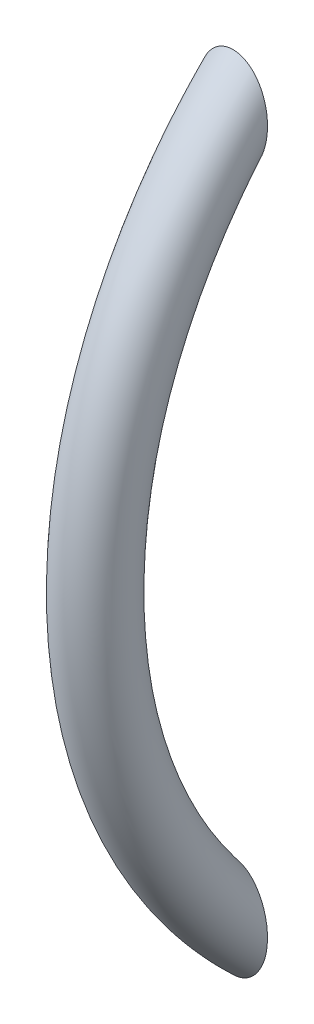
ISO-10303-21;
HEADER;
FILE_DESCRIPTION(('STEP AP214'),'2;1');
FILE_NAME('part.step','',(''),(''),'','','');
FILE_SCHEMA(('AUTOMOTIVE_DESIGN { 1 0 10303 214 1 1 1 1 }'));
ENDSEC;
DATA;
#1=APPLICATION_CONTEXT('core data for automotive mechanical design processes');
#2=APPLICATION_PROTOCOL_DEFINITION('international standard','automotive_design',2000,#1);
#3=PRODUCT_CONTEXT('',#1,'mechanical');
#4=PRODUCT('Part','Part','',(#3));
#5=PRODUCT_RELATED_PRODUCT_CATEGORY('part','',(#4));
#6=PRODUCT_DEFINITION_FORMATION('','',#4);
#7=PRODUCT_DEFINITION_CONTEXT('part definition',#1,'design');
#8=PRODUCT_DEFINITION('design','',#6,#7);
#9=PRODUCT_DEFINITION_SHAPE('','',#8);
#10=(LENGTH_UNIT() NAMED_UNIT(*) SI_UNIT(.MILLI.,.METRE.));
#11=(NAMED_UNIT(*) PLANE_ANGLE_UNIT() SI_UNIT($,.RADIAN.));
#12=(NAMED_UNIT(*) SI_UNIT($,.STERADIAN.) SOLID_ANGLE_UNIT());
#13=UNCERTAINTY_MEASURE_WITH_UNIT(LENGTH_MEASURE(1.E-05),#10,'distance_accuracy_value','');
#14=(GEOMETRIC_REPRESENTATION_CONTEXT(3) GLOBAL_UNCERTAINTY_ASSIGNED_CONTEXT((#13)) GLOBAL_UNIT_ASSIGNED_CONTEXT((#10,
#11,#12)) REPRESENTATION_CONTEXT('',''));
#15=CARTESIAN_POINT('',(0.,0.,0.));
#16=DIRECTION('',(0.,0.,1.));
#17=DIRECTION('',(1.,0.,0.));
#18=AXIS2_PLACEMENT_3D('',#15,#16,#17);
#19=CARTESIAN_POINT('',(-5.,-135.,0.));
#20=DIRECTION('',(0.,0.,1.));
#21=DIRECTION('',(1.,0.,0.));
#22=AXIS2_PLACEMENT_3D('',#19,#20,#21);
#23=PLANE('',#22);
#24=CARTESIAN_POINT('',(-2.34143220268921,-105.290489880751,0.));
#25=CARTESIAN_POINT('',(-2.16223381464412,-105.422127991153,0.));
#26=CARTESIAN_POINT('',(-1.97343885671479,-105.541187005868,0.));
#27=CARTESIAN_POINT('',(-1.67807058937642,-105.6963945522,0.));
#28=CARTESIAN_POINT('',(-1.57750229942348,-105.744261655668,0.));
#29=CARTESIAN_POINT('',(-1.37277015435048,-105.831524798696,0.));
#30=CARTESIAN_POINT('',(-1.26860798277112,-105.870924743782,0.));
#31=CARTESIAN_POINT('',(-1.05662525994243,-105.940843913188,0.));
#32=CARTESIAN_POINT('',(-0.948786052995977,-105.971306650597,0.));
#33=CARTESIAN_POINT('',(-0.730854813389401,-106.022478319425,0.));
#34=CARTESIAN_POINT('',(-0.620763732220418,-106.043191285103,0.));
#35=CARTESIAN_POINT('',(-0.399181796547366,-106.074484298361,0.));
#36=CARTESIAN_POINT('',(-0.28769139340899,-106.085067532403,0.));
#37=CARTESIAN_POINT('',(-0.0642122153162576,-106.095903569474,0.));
#38=CARTESIAN_POINT('',(0.0477765284588175,-106.096157009956,0.));
#39=CARTESIAN_POINT('',(0.263571391346182,-106.086671302039,0.));
#40=CARTESIAN_POINT('',(0.367408506280311,-106.077621019646,0.));
#41=CARTESIAN_POINT('',(0.573968617039572,-106.050719038081,0.));
#42=CARTESIAN_POINT('',(0.676691230488974,-106.032864410085,0.));
#43=CARTESIAN_POINT('',(0.880257799715599,-105.988648619741,0.));
#44=CARTESIAN_POINT('',(0.981102269587336,-105.962289822497,0.));
#45=CARTESIAN_POINT('',(1.18033594101478,-105.901478425116,0.));
#46=CARTESIAN_POINT('',(1.27872416007487,-105.867022641816,0.));
#47=CARTESIAN_POINT('',(1.57133839823747,-105.751441224562,0.));
#48=CARTESIAN_POINT('',(1.76102395195068,-105.6585448116,0.));
#49=CARTESIAN_POINT('',(2.1248464842067,-105.446346791508,0.));
#50=CARTESIAN_POINT('',(2.29897600292656,-105.327032610249,0.));
#51=CARTESIAN_POINT('',(2.58490090659034,-105.102323238759,0.));
#52=CARTESIAN_POINT('',(2.70074630219669,-105.002004100328,0.));
#53=CARTESIAN_POINT('',(2.92319529838527,-104.791577114148,0.));
#54=CARTESIAN_POINT('',(3.02979552739169,-104.681465724712,0.));
#55=CARTESIAN_POINT('',(3.33594670459079,-104.338359343486,0.));
#56=CARTESIAN_POINT('',(3.52160594326417,-104.092788289708,0.));
#57=CARTESIAN_POINT('',(3.80443203566377,-103.65887658351,0.));
#58=CARTESIAN_POINT('',(3.9111507900484,-103.476531839304,0.));
#59=CARTESIAN_POINT('',(4.10829790211831,-103.103224826291,0.));
#60=CARTESIAN_POINT('',(4.19872719078455,-102.912263050749,0.));
#61=CARTESIAN_POINT('',(4.36411184266114,-102.523536078742,0.));
#62=CARTESIAN_POINT('',(4.43904829393084,-102.325762907063,0.));
#63=CARTESIAN_POINT('',(4.57406374736376,-101.92524294268,0.));
#64=CARTESIAN_POINT('',(4.634142663205,-101.722496121089,0.));
#65=CARTESIAN_POINT('',(4.75820195554744,-101.243554230596,0.));
#66=CARTESIAN_POINT('',(4.81652798885232,-100.965886647963,0.));
#67=CARTESIAN_POINT('',(4.90908802326897,-100.406542924906,0.));
#68=CARTESIAN_POINT('',(4.94331393904633,-100.124865471515,0.));
#69=CARTESIAN_POINT('',(4.98876410461981,-99.5593468503363,0.));
#70=CARTESIAN_POINT('',(4.99996108927094,-99.2755035166713,0.));
#71=CARTESIAN_POINT('',(5.00003870562935,-98.7078657902034,0.));
#72=CARTESIAN_POINT('',(4.98892195464289,-98.4240713955649,0.));
#73=CARTESIAN_POINT('',(4.94445613279329,-97.8535937569007,0.));
#74=CARTESIAN_POINT('',(4.91074905106593,-97.56693841336,0.));
#75=CARTESIAN_POINT('',(4.82082328025927,-96.9971154779976,0.));
#76=CARTESIAN_POINT('',(4.76460053743666,-96.7139485236971,0.));
#77=CARTESIAN_POINT('',(4.62941776538043,-96.153478044977,0.));
#78=CARTESIAN_POINT('',(4.55048815886305,-95.8761672046342,0.));
#79=CARTESIAN_POINT('',(4.36911350084281,-95.3293931810883,0.));
#80=CARTESIAN_POINT('',(4.26667968148378,-95.0599263185111,0.));
#81=CARTESIAN_POINT('',(4.07843376493363,-94.627035181489,0.));
#82=CARTESIAN_POINT('',(3.99994342528465,-94.4604049457385,0.));
#83=CARTESIAN_POINT('',(3.83236204377457,-94.1325799257493,0.));
#84=CARTESIAN_POINT('',(3.74327358303189,-93.971383830277,0.));
#85=CARTESIAN_POINT('',(3.554016268221,-93.6557957919539,0.));
#86=CARTESIAN_POINT('',(3.45385779179038,-93.5013976630778,0.));
#87=CARTESIAN_POINT('',(3.24181327273711,-93.20093576096,0.));
#88=CARTESIAN_POINT('',(3.12993088815446,-93.054869409913,0.));
#89=CARTESIAN_POINT('',(2.84263251644425,-92.7120875058244,0.));
#90=CARTESIAN_POINT('',(2.66065085922295,-92.5207530547834,0.));
#91=CARTESIAN_POINT('',(2.26976249232931,-92.1678784601289,0.));
#92=CARTESIAN_POINT('',(2.06090008521724,-92.0062903330652,0.));
#93=CARTESIAN_POINT('',(1.67087147782921,-91.758972588719,0.));
#94=CARTESIAN_POINT('',(1.49542993552283,-91.6643557943834,0.));
#95=CARTESIAN_POINT('',(1.22259799931958,-91.5447357487474,0.));
#96=CARTESIAN_POINT('',(1.13003166370627,-91.5085771644537,0.));
#97=CARTESIAN_POINT('',(0.942135663636936,-91.4444040406918,0.));
#98=CARTESIAN_POINT('',(0.846807278492459,-91.4163857950984,0.));
#99=CARTESIAN_POINT('',(0.653166874337043,-91.3689292148003,0.));
#100=CARTESIAN_POINT('',(0.554836352278711,-91.3495660308696,0.));
#101=CARTESIAN_POINT('',(0.356773225980305,-91.3202698668198,0.));
#102=CARTESIAN_POINT('',(0.257040630466234,-91.3103368280373,0.));
#103=CARTESIAN_POINT('',(0.0571074964343261,-91.3001822326924,0.));
#104=CARTESIAN_POINT('',(-0.0430928723371553,-91.2999573913803,0.));
#105=CARTESIAN_POINT('',(-0.243012916143502,-91.3092005697146,0.));
#106=CARTESIAN_POINT('',(-0.342732625245004,-91.3186678919726,0.));
#107=CARTESIAN_POINT('',(-0.61603243482593,-91.3578710526534,0.));
#108=CARTESIAN_POINT('',(-0.788272610918055,-91.3975331937492,0.));
#109=CARTESIAN_POINT('',(-1.12432622638592,-91.503120816903,0.));
#110=CARTESIAN_POINT('',(-1.28813576524412,-91.569058334351,0.));
#111=CARTESIAN_POINT('',(-1.66579091733863,-91.7526922271403,0.));
#112=CARTESIAN_POINT('',(-1.87469207470183,-91.8805411744778,0.));
#113=CARTESIAN_POINT('',(-2.26937958736412,-92.1680356817859,0.));
#114=CARTESIAN_POINT('',(-2.45511353711332,-92.32775127956,0.));
#115=CARTESIAN_POINT('',(-2.75878028057195,-92.6262461328467,0.));
#116=CARTESIAN_POINT('',(-2.88188050403309,-92.7598792760355,0.));
#117=CARTESIAN_POINT('',(-3.11601511802788,-93.0374029356281,0.));
#118=CARTESIAN_POINT('',(-3.22704370559242,-93.1812983306544,0.));
#119=CARTESIAN_POINT('',(-3.43775054279065,-93.4774587955236,0.));
#120=CARTESIAN_POINT('',(-3.53741071656291,-93.6297366389912,0.));
#121=CARTESIAN_POINT('',(-3.72578832039043,-93.9408671639505,0.));
#122=CARTESIAN_POINT('',(-3.81450611111021,-94.09971962851,0.));
#123=CARTESIAN_POINT('',(-4.02230378696889,-94.5015718600783,0.));
#124=CARTESIAN_POINT('',(-4.13509682566886,-94.7478360779157,0.));
#125=CARTESIAN_POINT('',(-4.33914065443283,-95.2491635052415,0.));
#126=CARTESIAN_POINT('',(-4.43038133588819,-95.5042307795641,0.));
#127=CARTESIAN_POINT('',(-4.59231368709969,-96.0210193010417,0.));
#128=CARTESIAN_POINT('',(-4.6629878442852,-96.2827460137753,0.));
#129=CARTESIAN_POINT('',(-4.78424831878448,-96.8107468365847,0.));
#130=CARTESIAN_POINT('',(-4.83483764467501,-97.0770202593557,0.));
#131=CARTESIAN_POINT('',(-4.91735022020652,-97.6203200731743,0.));
#132=CARTESIAN_POINT('',(-4.9486916747321,-97.8974348108409,0.));
#133=CARTESIAN_POINT('',(-4.99027251381138,-98.453275524848,0.));
#134=CARTESIAN_POINT('',(-5.00050958934165,-98.7320016741474,0.));
#135=CARTESIAN_POINT('',(-4.99945188256551,-99.2892146980422,0.));
#136=CARTESIAN_POINT('',(-4.9881734880575,-99.5677015932409,0.));
#137=CARTESIAN_POINT('',(-4.94339387115272,-100.122854009729,0.));
#138=CARTESIAN_POINT('',(-4.90989753858287,-100.399519918261,0.));
#139=CARTESIAN_POINT('',(-4.82810572199283,-100.897570676364,0.));
#140=CARTESIAN_POINT('',(-4.78375935143456,-101.1196000896,0.));
#141=CARTESIAN_POINT('',(-4.67905402246949,-101.559772330546,0.));
#142=CARTESIAN_POINT('',(-4.6186946484905,-101.777915057231,0.));
#143=CARTESIAN_POINT('',(-4.41233436668741,-102.424303398367,0.));
#144=CARTESIAN_POINT('',(-4.24094800054539,-102.845176754873,0.));
#145=CARTESIAN_POINT('',(-3.95666135143909,-103.392372663522,0.));
#146=CARTESIAN_POINT('',(-3.87585086873178,-103.53584551884,0.));
#147=CARTESIAN_POINT('',(-3.70402431954435,-103.81653505729,0.));
#148=CARTESIAN_POINT('',(-3.61300763689449,-103.953751361995,0.));
#149=CARTESIAN_POINT('',(-3.32470073921123,-104.353217571635,0.));
#150=CARTESIAN_POINT('',(-3.11149168519851,-104.604593517259,0.));
#151=CARTESIAN_POINT('',(-2.79336532739651,-104.916100540571,0.));
#152=CARTESIAN_POINT('',(-2.70677660057598,-104.995422749056,0.));
#153=CARTESIAN_POINT('',(-2.52816540400676,-105.1478341523,0.));
#154=CARTESIAN_POINT('',(-2.43613903686921,-105.220918782319,0.));
#155=CARTESIAN_POINT('',(-2.34143220268921,-105.290489880751,0.));
#156=B_SPLINE_CURVE_WITH_KNOTS('',3,(#24,#25,#26,#27,#28,#29,#30,#31,#32,#33,#34,#35,#36,#37,
#38,#39,#40,#41,#42,#43,#44,#45,#46,#47,#48,#49,#50,#51,#52,#53,#54,#55,#56,#57,#58,#59,#60,#61,
#62,#63,#64,#65,#66,#67,#68,#69,#70,#71,#72,#73,#74,#75,#76,#77,#78,#79,#80,#81,#82,#83,#84,#85,
#86,#87,#88,#89,#90,#91,#92,#93,#94,#95,#96,#97,#98,#99,#100,#101,#102,#103,#104,#105,#106,#107,
#108,#109,#110,#111,#112,#113,#114,#115,#116,#117,#118,#119,#120,#121,#122,#123,#124,#125,#126,
#127,#128,#129,#130,#131,#132,#133,#134,#135,#136,#137,#138,#139,#140,#141,#142,#143,#144,#145,
#146,#147,#148,#149,#150,#151,#152,#153,#154,#155),.UNSPECIFIED.,.T.,.F.,(4,2,2,2,2,2,2,2,2,2,2,
2,2,2,2,2,2,2,2,2,2,2,2,2,2,2,2,2,2,2,2,2,2,2,2,2,2,2,2,2,2,2,2,2,2,2,2,2,2,2,2,2,2,2,2,2,2,2,2,
2,2,2,2,2,2,4),(0.,0.666633570219647,1.0004695984409,1.33415131079862,1.66989871230028,
2.0055070659124,2.3410098140764,2.67649185824217,2.9888059656518,3.30122403662121,
3.61355529541587,3.92600954682955,4.55696417354133,5.18821976535481,5.64734519928261,
6.10663737152841,7.02614514846745,7.65927555383115,8.29236976282706,8.9262322787464,
9.56009847730783,10.4100909040609,11.2603683585882,12.1116519225042,12.9628356403149,
13.8278382966406,14.6929967590194,15.5570014355049,16.4205940799944,16.9728379838865,
17.5249476658812,18.0765440911225,18.6279689193712,19.4176243848467,20.2059946856974,
20.8014969302228,21.0993138162852,21.3969948993407,21.6972127536325,21.9974287403026,
22.2975431486799,22.5976359641865,23.1253184120825,23.6532428423375,24.3839153974043,
25.1162119036399,25.6605755203764,26.205199672417,26.7506780536933,27.296138451017,
28.1075499451111,28.9193412596929,29.7318218122856,30.5441806146288,31.3800200780871,
32.2159509856251,33.0512454395903,33.8863561190458,34.5649852898251,35.2436320742272,
36.5989168731248,37.0925647550839,37.5862424556644,38.5692378412626,38.9213000183173,
39.2736176685058),.UNSPECIFIED.);
#157=CARTESIAN_POINT('',(-2.34143220268921,-105.290489880751,0.));
#158=VERTEX_POINT('',#157);
#159=EDGE_CURVE('E10',#158,#158,#156,.T.);
#160=ORIENTED_EDGE('',*,*,#159,.F.);
#161=EDGE_LOOP('',(#160));
#162=FACE_BOUND('',#161,.T.);
#163=CARTESIAN_POINT('',(0.,-96.,0.));
#164=DIRECTION('',(0.,0.,1.));
#165=DIRECTION('',(1.,0.,0.));
#166=AXIS2_PLACEMENT_3D('',#163,#164,#165);
#167=CIRCLE('',#166,2.5);
#168=CARTESIAN_POINT('',(2.5,-96.,0.));
#169=VERTEX_POINT('',#168);
#170=EDGE_CURVE('E81',#169,#169,#167,.T.);
#171=ORIENTED_EDGE('',*,*,#170,.T.);
#172=EDGE_LOOP('',(#171));
#173=FACE_BOUND('',#172,.T.);
#174=ADVANCED_FACE('F32',(#162,#173),#23,.F.);
#175=CARTESIAN_POINT('',(-1.60320775611275,-4.27324311851113,0.));
#176=CARTESIAN_POINT('',(-1.44003004226218,-4.36199674768197,0.));
#177=CARTESIAN_POINT('',(-1.27037893986694,-4.43930199524779,0.));
#178=CARTESIAN_POINT('',(-0.920747760818282,-4.56586899660333,0.));
#179=CARTESIAN_POINT('',(-0.740764522428102,-4.61512211526167,0.));
#180=CARTESIAN_POINT('',(-0.373866406424968,-4.68163762509022,0.));
#181=CARTESIAN_POINT('',(-0.186920274600814,-4.6987318414051,0.));
#182=CARTESIAN_POINT('',(0.186911829476399,-4.69872778059384,0.));
#183=CARTESIAN_POINT('',(0.37379780093519,-4.68164093904719,0.));
#184=CARTESIAN_POINT('',(0.730092136866356,-4.61706549277781,0.));
#185=CARTESIAN_POINT('',(0.899864726957343,-4.57153313564977,0.));
#186=CARTESIAN_POINT('',(1.23050860348446,-4.45531394204507,0.));
#187=CARTESIAN_POINT('',(1.39137469085836,-4.38461258869135,0.));
#188=CARTESIAN_POINT('',(1.76957517053089,-4.18683412042799,0.));
#189=CARTESIAN_POINT('',(1.98106515878691,-4.04861006784394,0.));
#190=CARTESIAN_POINT('',(2.37938489879524,-3.74021218617032,0.));
#191=CARTESIAN_POINT('',(2.56615494786702,-3.56996332713964,0.));
#192=CARTESIAN_POINT('',(2.87158283294623,-3.25218075663238,0.));
#193=CARTESIAN_POINT('',(2.99557259880357,-3.10966535951759,0.));
#194=CARTESIAN_POINT('',(3.23072825647715,-2.81434313784091,0.));
#195=CARTESIAN_POINT('',(3.34188784599942,-2.66153131346053,0.));
#196=CARTESIAN_POINT('',(3.55216836468416,-2.34756014550755,0.));
#197=CARTESIAN_POINT('',(3.65127103306183,-2.18638865465629,0.));
#198=CARTESIAN_POINT('',(3.83790015327057,-1.85752790026166,0.));
#199=CARTESIAN_POINT('',(3.92542703661779,-1.68983887997707,0.));
#200=CARTESIAN_POINT('',(4.12797789398752,-1.26926797667782,0.));
#201=CARTESIAN_POINT('',(4.23664785719536,-1.01331257685581,0.));
#202=CARTESIAN_POINT('',(4.43166675442019,-0.493002251171198,0.));
#203=CARTESIAN_POINT('',(4.51800566056867,-0.22864361141924,0.));
#204=CARTESIAN_POINT('',(4.6692835333219,0.306358432185299,0.));
#205=CARTESIAN_POINT('',(4.73420344968882,0.57700720278629,0.));
#206=CARTESIAN_POINT('',(4.8430070133762,1.12243851286283,0.));
#207=CARTESIAN_POINT('',(4.88689378186162,1.39722043276381,0.));
#208=CARTESIAN_POINT('',(4.95457678656839,1.95609163013538,0.));
#209=CARTESIAN_POINT('',(4.97785375411642,2.24024386749504,0.));
#210=CARTESIAN_POINT('',(5.00221015293486,2.80954328010073,0.));
#211=CARTESIAN_POINT('',(5.00328671800364,3.09469057906197,0.));
#212=CARTESIAN_POINT('',(4.9826495215097,3.66391632255549,0.));
#213=CARTESIAN_POINT('',(4.96095660714245,3.94799550623583,0.));
#214=CARTESIAN_POINT('',(4.89389609756446,4.51331188512043,0.));
#215=CARTESIAN_POINT('',(4.84853559470574,4.79454990600012,0.));
#216=CARTESIAN_POINT('',(4.7469336191533,5.28422561456114,0.));
#217=CARTESIAN_POINT('',(4.69600513016628,5.49376553779361,0.));
#218=CARTESIAN_POINT('',(4.57922877420175,5.90858721576795,0.));
#219=CARTESIAN_POINT('',(4.51338107173251,6.11386901743519,0.));
#220=CARTESIAN_POINT('',(4.29244226107616,6.72082248039232,0.));
#221=CARTESIAN_POINT('',(4.11377894781623,7.11449488833894,0.));
#222=CARTESIAN_POINT('',(3.7446306056143,7.76266803269553,0.));
#223=CARTESIAN_POINT('',(3.57005248564781,8.02625395662822,0.));
#224=CARTESIAN_POINT('',(3.18184996330463,8.52303626759181,0.));
#225=CARTESIAN_POINT('',(2.96828314984594,8.75627661813754,0.));
#226=CARTESIAN_POINT('',(2.55269112200103,9.1337134755392,0.));
#227=CARTESIAN_POINT('',(2.35830962287397,9.28623543575298,0.));
#228=CARTESIAN_POINT('',(2.05017649768571,9.48980646463548,0.));
#229=CARTESIAN_POINT('',(1.94466596842402,9.55347913672672,0.));
#230=CARTESIAN_POINT('',(1.72856001630843,9.67146702257246,0.));
#231=CARTESIAN_POINT('',(1.6179669497811,9.7257865182214,0.));
#232=CARTESIAN_POINT('',(1.39120250854118,9.82461795449798,0.));
#233=CARTESIAN_POINT('',(1.27498776416631,9.86903070459856,0.));
#234=CARTESIAN_POINT('',(1.03887759912143,9.94647654076272,0.));
#235=CARTESIAN_POINT('',(0.918984169630771,9.97951566873813,0.));
#236=CARTESIAN_POINT('',(0.676561177540438,10.0335076634126,0.));
#237=CARTESIAN_POINT('',(0.554033008803282,10.0544667652295,0.));
#238=CARTESIAN_POINT('',(0.307486957165771,10.0838292373438,0.));
#239=CARTESIAN_POINT('',(0.183469311248446,10.0922345790126,0.));
#240=CARTESIAN_POINT('',(-0.0469766598456306,10.096004573468,0.));
#241=CARTESIAN_POINT('',(-0.153380639657971,10.0930642912356,0.));
#242=CARTESIAN_POINT('',(-0.365557031168587,10.0778810260969,0.));
#243=CARTESIAN_POINT('',(-0.471329239916196,10.0656352004766,0.));
#244=CARTESIAN_POINT('',(-0.681368671540477,10.0320562140549,0.));
#245=CARTESIAN_POINT('',(-0.785636586149964,10.0107273772261,0.));
#246=CARTESIAN_POINT('',(-0.992016770549977,9.95934923086659,0.));
#247=CARTESIAN_POINT('',(-1.09412817489212,9.92929648902111,0.));
#248=CARTESIAN_POINT('',(-1.39167816347824,9.82827258267544,0.));
#249=CARTESIAN_POINT('',(-1.58325185924491,9.74561119160676,0.));
#250=CARTESIAN_POINT('',(-1.95201739559035,9.55302245237495,0.));
#251=CARTESIAN_POINT('',(-2.12920316939237,9.44308368092275,0.));
#252=CARTESIAN_POINT('',(-2.41786549261855,9.23604674468987,0.));
#253=CARTESIAN_POINT('',(-2.53343313855827,9.1445571934808,0.));
#254=CARTESIAN_POINT('',(-2.75610912299129,8.95176969971522,0.));
#255=CARTESIAN_POINT('',(-2.86321461317879,8.85046847993865,0.));
#256=CARTESIAN_POINT('',(-3.17185006238229,8.53375438150469,0.));
#257=CARTESIAN_POINT('',(-3.36048051045135,8.30569254372811,0.));
#258=CARTESIAN_POINT('',(-3.76716670556603,7.73711446022458,0.));
#259=CARTESIAN_POINT('',(-3.97047551212497,7.38611542231642,0.));
#260=CARTESIAN_POINT('',(-4.23148978323575,6.83931112069521,0.));
#261=CARTESIAN_POINT('',(-4.31123360614588,6.65344152359049,0.));
#262=CARTESIAN_POINT('',(-4.4567768935316,6.27626958656446,0.));
#263=CARTESIAN_POINT('',(-4.52257620843033,6.08496718839274,0.));
#264=CARTESIAN_POINT('',(-4.66204078850096,5.62893495604693,0.));
#265=CARTESIAN_POINT('',(-4.73006247532665,5.36247910184226,0.));
#266=CARTESIAN_POINT('',(-4.84287522126595,4.82466634540866,0.));
#267=CARTESIAN_POINT('',(-4.88765811369087,4.55330775485698,0.));
#268=CARTESIAN_POINT('',(-4.95512885078136,4.00761487645807,0.));
#269=CARTESIAN_POINT('',(-4.97779500391279,3.73327793354949,0.));
#270=CARTESIAN_POINT('',(-5.00181025563506,3.18372596915132,0.));
#271=CARTESIAN_POINT('',(-5.003161728931,2.90851104889592,0.));
#272=CARTESIAN_POINT('',(-4.98494644468477,2.35338527565322,0.));
#273=CARTESIAN_POINT('',(-4.96496962176591,2.07348797801446,0.));
#274=CARTESIAN_POINT('',(-4.90373348853139,1.51599280889699,0.));
#275=CARTESIAN_POINT('',(-4.86247144458185,1.2383952374231,0.));
#276=CARTESIAN_POINT('',(-4.75864978143885,0.687452710101066,0.));
#277=CARTESIAN_POINT('',(-4.69610864232416,0.414104278714647,0.));
#278=CARTESIAN_POINT('',(-4.54929705765338,-0.12666180539534,0.));
#279=CARTESIAN_POINT('',(-4.46503330002899,-0.394081256054403,0.));
#280=CARTESIAN_POINT('',(-4.29953163310334,-0.850137118456648,0.));
#281=CARTESIAN_POINT('',(-4.22353236710871,-1.04068421630753,0.));
#282=CARTESIAN_POINT('',(-4.05890739932178,-1.41628713157061,0.));
#283=CARTESIAN_POINT('',(-3.97028136406494,-1.60134280380193,0.));
#284=CARTESIAN_POINT('',(-3.77978047657384,-1.96448822152272,0.));
#285=CARTESIAN_POINT('',(-3.67790827948408,-2.14257935374786,0.));
#286=CARTESIAN_POINT('',(-3.46014120138683,-2.48995059336102,0.));
#287=CARTESIAN_POINT('',(-3.34425189649187,-2.65923416638548,0.));
#288=CARTESIAN_POINT('',(-3.1339128510729,-2.93831649232838,0.));
#289=CARTESIAN_POINT('',(-3.04321656124783,-3.05093751125802,0.));
#290=CARTESIAN_POINT('',(-2.85412546648248,-3.26947094721704,0.));
#291=CARTESIAN_POINT('',(-2.7557296832465,-3.3753825086406,0.));
#292=CARTESIAN_POINT('',(-2.44923047614832,-3.6803290761427,0.));
#293=CARTESIAN_POINT('',(-2.22890384290196,-3.86782134760098,0.));
#294=CARTESIAN_POINT('',(-1.93017056847962,-4.07573703524914,0.));
#295=CARTESIAN_POINT('',(-1.86636010305738,-4.11773876374363,0.));
#296=CARTESIAN_POINT('',(-1.73646951003587,-4.1982238214904,0.));
#297=CARTESIAN_POINT('',(-1.67038722976618,-4.23670367968808,0.));
#298=CARTESIAN_POINT('',(-1.60320775611275,-4.27324311851113,0.));
#299=B_SPLINE_CURVE_WITH_KNOTS('',3,(#175,#176,#177,#178,#179,#180,#181,#182,#183,#184,#185,
#186,#187,#188,#189,#190,#191,#192,#193,#194,#195,#196,#197,#198,#199,#200,#201,#202,#203,#204,
#205,#206,#207,#208,#209,#210,#211,#212,#213,#214,#215,#216,#217,#218,#219,#220,#221,#222,#223,
#224,#225,#226,#227,#228,#229,#230,#231,#232,#233,#234,#235,#236,#237,#238,#239,#240,#241,#242,
#243,#244,#245,#246,#247,#248,#249,#250,#251,#252,#253,#254,#255,#256,#257,#258,#259,#260,#261,
#262,#263,#264,#265,#266,#267,#268,#269,#270,#271,#272,#273,#274,#275,#276,#277,#278,#279,#280,
#281,#282,#283,#284,#285,#286,#287,#288,#289,#290,#291,#292,#293,#294,#295,#296,#297,#298),
.UNSPECIFIED.,.T.,.F.,(4,2,2,2,2,2,2,2,2,2,2,2,2,2,2,2,2,2,2,2,2,2,2,2,2,2,2,2,2,2,2,2,2,2,2,2,
2,2,2,2,2,2,2,2,2,2,2,2,2,2,2,2,2,2,2,2,2,2,2,2,2,4),(0.,0.557017958765675,1.11420728874032,
1.67430242471155,2.23421020716993,2.7593063284504,3.28470580466714,4.03845397546802,
4.79399058543813,5.35996015298819,5.92620655708653,6.49330016521854,7.06037262756485,
7.89337762131437,8.72675603304797,9.56087367319002,10.3948674980344,11.2493207035536,
12.1038842232821,12.9576660068428,13.8111920885538,14.4575598802687,15.1039205450889,
16.3939369559401,17.339353215449,18.2833841669571,19.0214979671774,19.3908102979115,
19.7599531049255,20.1326407686168,20.5051301460135,20.8774270900639,21.2496655645628,
21.5685994794847,21.8876308634668,22.2065105418565,22.5255158500313,23.1487446847005,
23.7722349585229,24.2138573673979,24.6556277957333,25.5399731280594,26.750002834025,
27.356362646542,27.9627289628959,28.7865831609186,29.6107266860009,30.4356777000131,
31.2605368041663,32.1015454024823,32.9426620373637,33.783050051353,34.623179636132,
35.2382061244293,35.8532488581773,36.4681684983716,37.0828443184467,37.5162843741267,
37.9497795922974,38.8121784568761,39.0412766354269,39.2705982284457),.UNSPECIFIED.);
#300=CARTESIAN_POINT('',(-1.60320775611275,-4.27324311851113,0.));
#301=VERTEX_POINT('',#300);
#302=EDGE_CURVE('E42',#301,#301,#299,.T.);
#303=ORIENTED_EDGE('',*,*,#302,.F.);
#304=EDGE_LOOP('',(#303));
#305=FACE_BOUND('',#304,.T.);
#306=CARTESIAN_POINT('',(0.,0.,0.));
#307=DIRECTION('',(0.,0.,1.));
#308=DIRECTION('',(1.,0.,0.));
#309=AXIS2_PLACEMENT_3D('',#306,#307,#308);
#310=CIRCLE('',#309,2.5);
#311=CARTESIAN_POINT('',(2.5,0.,0.));
#312=VERTEX_POINT('',#311);
#313=EDGE_CURVE('E50',#312,#312,#310,.T.);
#314=ORIENTED_EDGE('',*,*,#313,.T.);
#315=EDGE_LOOP('',(#314));
#316=FACE_BOUND('',#315,.T.);
#317=ADVANCED_FACE('F58',(#305,#316),#23,.F.);
#318=CARTESIAN_POINT('',(0.,-48.,-55.));
#319=DIRECTION('',(-1.,0.,0.));
#320=DIRECTION('',(0.,0.,1.));
#321=AXIS2_PLACEMENT_3D('',#318,#319,#320);
#322=TOROIDAL_SURFACE('',#321,75.,5.);
#323=ORIENTED_EDGE('',*,*,#302,.T.);
#324=EDGE_LOOP('',(#323));
#325=FACE_BOUND('',#324,.T.);
#326=ORIENTED_EDGE('',*,*,#159,.T.);
#327=EDGE_LOOP('',(#326));
#328=FACE_BOUND('',#327,.T.);
#329=ADVANCED_FACE('F34',(#325,#328),#322,.T.);
#330=CARTESIAN_POINT('',(0.,0.,5.));
#331=DIRECTION('',(0.,0.,-1.));
#332=DIRECTION('',(-1.,0.,0.));
#333=AXIS2_PLACEMENT_3D('',#330,#331,#332);
#334=CYLINDRICAL_SURFACE('',#333,2.5);
#335=CARTESIAN_POINT('',(0.,0.,5.));
#336=DIRECTION('',(0.,0.,1.));
#337=DIRECTION('',(1.,0.,0.));
#338=AXIS2_PLACEMENT_3D('',#335,#336,#337);
#339=CIRCLE('',#338,2.5);
#340=CARTESIAN_POINT('',(2.5,0.,5.));
#341=VERTEX_POINT('',#340);
#342=EDGE_CURVE('E46',#341,#341,#339,.T.);
#343=ORIENTED_EDGE('',*,*,#342,.T.);
#344=EDGE_LOOP('',(#343));
#345=FACE_BOUND('',#344,.T.);
#346=ORIENTED_EDGE('',*,*,#313,.F.);
#347=EDGE_LOOP('',(#346));
#348=FACE_BOUND('',#347,.T.);
#349=ADVANCED_FACE('F60',(#345,#348),#334,.F.);
#350=CARTESIAN_POINT('',(0.,0.,5.));
#351=DIRECTION('',(0.,0.,1.));
#352=DIRECTION('',(1.,0.,0.));
#353=AXIS2_PLACEMENT_3D('',#350,#351,#352);
#354=PLANE('',#353);
#355=ORIENTED_EDGE('',*,*,#342,.F.);
#356=EDGE_LOOP('',(#355));
#357=FACE_BOUND('',#356,.T.);
#358=ADVANCED_FACE('F64',(#357),#354,.F.);
#359=CARTESIAN_POINT('',(0.,-96.,5.));
#360=DIRECTION('',(0.,0.,-1.));
#361=DIRECTION('',(-1.,0.,0.));
#362=AXIS2_PLACEMENT_3D('',#359,#360,#361);
#363=CYLINDRICAL_SURFACE('',#362,2.5);
#364=CARTESIAN_POINT('',(0.,-96.,5.));
#365=DIRECTION('',(0.,0.,1.));
#366=DIRECTION('',(1.,0.,0.));
#367=AXIS2_PLACEMENT_3D('',#364,#365,#366);
#368=CIRCLE('',#367,2.5);
#369=CARTESIAN_POINT('',(2.5,-96.,5.));
#370=VERTEX_POINT('',#369);
#371=EDGE_CURVE('E80',#370,#370,#368,.T.);
#372=ORIENTED_EDGE('',*,*,#371,.T.);
#373=EDGE_LOOP('',(#372));
#374=FACE_BOUND('',#373,.T.);
#375=ORIENTED_EDGE('',*,*,#170,.F.);
#376=EDGE_LOOP('',(#375));
#377=FACE_BOUND('',#376,.T.);
#378=ADVANCED_FACE('F68',(#374,#377),#363,.F.);
#379=CARTESIAN_POINT('',(0.,-96.,5.));
#380=DIRECTION('',(0.,0.,1.));
#381=DIRECTION('',(1.,0.,0.));
#382=AXIS2_PLACEMENT_3D('',#379,#380,#381);
#383=PLANE('',#382);
#384=ORIENTED_EDGE('',*,*,#371,.F.);
#385=EDGE_LOOP('',(#384));
#386=FACE_BOUND('',#385,.T.);
#387=ADVANCED_FACE('F72',(#386),#383,.F.);
#388=CLOSED_SHELL('',(#174,#317,#329,#349,#358,#378,#387));
#389=MANIFOLD_SOLID_BREP('B2',#388);
#390=ADVANCED_BREP_SHAPE_REPRESENTATION('',(#18,#389),#14);
#391=SHAPE_DEFINITION_REPRESENTATION(#9,#390);
ENDSEC;
END-ISO-10303-21;
